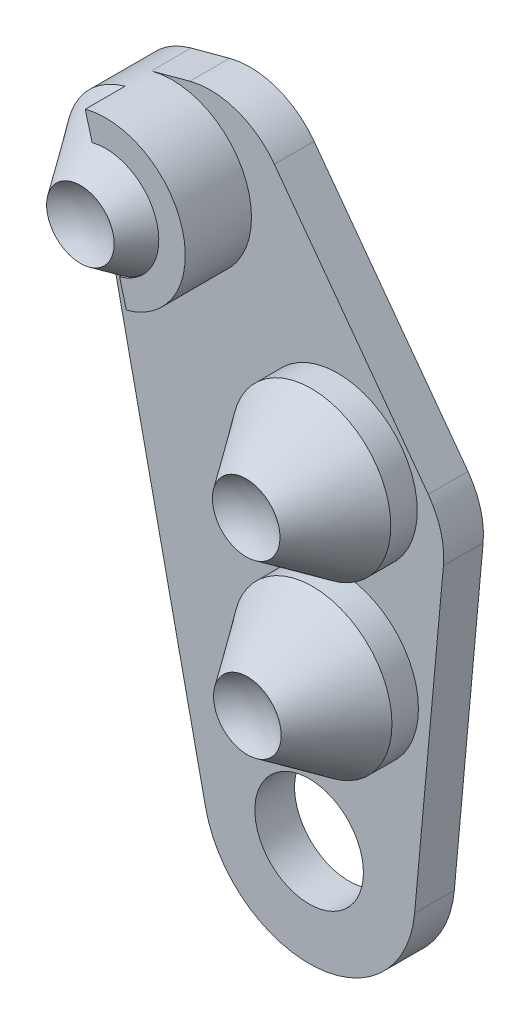
ISO-10303-21;
HEADER;
FILE_DESCRIPTION(('STEP AP214'),'2;1');
FILE_NAME('part.step','',(''),(''),'','','');
FILE_SCHEMA(('AUTOMOTIVE_DESIGN { 1 0 10303 214 1 1 1 1 }'));
ENDSEC;
DATA;
#1=APPLICATION_CONTEXT('core data for automotive mechanical design processes');
#2=APPLICATION_PROTOCOL_DEFINITION('international standard','automotive_design',2000,#1);
#3=PRODUCT_CONTEXT('',#1,'mechanical');
#4=PRODUCT('Part','Part','',(#3));
#5=PRODUCT_RELATED_PRODUCT_CATEGORY('part','',(#4));
#6=PRODUCT_DEFINITION_FORMATION('','',#4);
#7=PRODUCT_DEFINITION_CONTEXT('part definition',#1,'design');
#8=PRODUCT_DEFINITION('design','',#6,#7);
#9=PRODUCT_DEFINITION_SHAPE('','',#8);
#10=(LENGTH_UNIT() NAMED_UNIT(*) SI_UNIT(.MILLI.,.METRE.));
#11=(NAMED_UNIT(*) PLANE_ANGLE_UNIT() SI_UNIT($,.RADIAN.));
#12=(NAMED_UNIT(*) SI_UNIT($,.STERADIAN.) SOLID_ANGLE_UNIT());
#13=UNCERTAINTY_MEASURE_WITH_UNIT(LENGTH_MEASURE(1.E-05),#10,'distance_accuracy_value','');
#14=(GEOMETRIC_REPRESENTATION_CONTEXT(3) GLOBAL_UNCERTAINTY_ASSIGNED_CONTEXT((#13)) GLOBAL_UNIT_ASSIGNED_CONTEXT((#10,
#11,#12)) REPRESENTATION_CONTEXT('',''));
#15=CARTESIAN_POINT('',(0.,0.,0.));
#16=DIRECTION('',(0.,0.,1.));
#17=DIRECTION('',(1.,0.,0.));
#18=AXIS2_PLACEMENT_3D('',#15,#16,#17);
#19=CARTESIAN_POINT('',(-10.352761804101,38.6370330515627,10.));
#20=DIRECTION('',(0.,0.,-1.));
#21=DIRECTION('',(-1.,0.,0.));
#22=AXIS2_PLACEMENT_3D('',#19,#20,#21);
#23=CONICAL_SURFACE('',#22,2.49896230895139,0.610865238198022);
#24=CARTESIAN_POINT('',(-10.352761804101,38.6370330515627,9.92147057076465));
#25=DIRECTION('',(0.,0.,-1.));
#26=DIRECTION('',(-1.,0.,0.));
#27=AXIS2_PLACEMENT_3D('',#24,#25,#26);
#28=CIRCLE('',#27,2.55394920727329);
#29=CARTESIAN_POINT('',(-12.9067110113743,38.6370330515627,9.92147057076465));
#30=VERTEX_POINT('',#29);
#31=EDGE_CURVE('E275',#30,#30,#28,.F.);
#32=ORIENTED_EDGE('',*,*,#31,.F.);
#33=EDGE_LOOP('',(#32));
#34=FACE_BOUND('',#33,.T.);
#35=CARTESIAN_POINT('',(-10.352761804101,38.6370330515627,4.99999999999998));
#36=DIRECTION('',(0.,0.,1.));
#37=DIRECTION('',(1.,0.,0.));
#38=AXIS2_PLACEMENT_3D('',#35,#36,#37);
#39=CIRCLE('',#38,6.);
#40=CARTESIAN_POINT('',(-8.79984753348585,32.8414780938283,4.99999999999998));
#41=VERTEX_POINT('',#40);
#42=CARTESIAN_POINT('',(-11.9056760747161,44.4325880092971,4.99999999999998));
#43=VERTEX_POINT('',#42);
#44=EDGE_CURVE('E278',#41,#43,#39,.F.);
#45=ORIENTED_EDGE('',*,*,#44,.F.);
#46=DIRECTION('',(0.148452505549688,-0.554032293222328,-0.819152044288988));
#47=VECTOR('',#46,1.);
#48=CARTESIAN_POINT('',(-10.352761804101,38.6370330515627,13.5688880404525));
#49=LINE('',#48,#47);
#50=CARTESIAN_POINT('',(-9.3174856236909,34.7733297464064,7.85629601348416));
#51=VERTEX_POINT('',#50);
#52=EDGE_CURVE('E12',#41,#51,#49,.F.);
#53=ORIENTED_EDGE('',*,*,#52,.T.);
#54=CARTESIAN_POINT('',(-10.352761804101,38.6370330515627,7.85629601348416));
#55=DIRECTION('',(0.,0.,-1.));
#56=DIRECTION('',(-1.,0.,0.));
#57=AXIS2_PLACEMENT_3D('',#54,#55,#56);
#58=CIRCLE('',#57,4.00000000000001);
#59=CARTESIAN_POINT('',(-11.3880379845111,42.500736356719,7.85629601348415));
#60=VERTEX_POINT('',#59);
#61=EDGE_CURVE('E80',#60,#51,#58,.T.);
#62=ORIENTED_EDGE('',*,*,#61,.F.);
#63=DIRECTION('',(-0.148452505549687,0.554032293222328,-0.819152044288988));
#64=VECTOR('',#63,1.);
#65=CARTESIAN_POINT('',(-10.352761804101,38.6370330515627,13.5688880404525));
#66=LINE('',#65,#64);
#67=EDGE_CURVE('E90',#43,#60,#66,.F.);
#68=ORIENTED_EDGE('',*,*,#67,.F.);
#69=EDGE_LOOP('',(#45,#53,#62,#68));
#70=FACE_BOUND('',#69,.T.);
#71=ADVANCED_FACE('F72',(#34,#70),#23,.T.);
#72=CARTESIAN_POINT('',(0.,0.,3.));
#73=DIRECTION('',(0.,0.,-1.));
#74=DIRECTION('',(-1.,0.,0.));
#75=AXIS2_PLACEMENT_3D('',#72,#73,#74);
#76=CYLINDRICAL_SURFACE('',#75,8.);
#77=CARTESIAN_POINT('',(0.,0.,0.));
#78=DIRECTION('',(0.,0.,1.));
#79=DIRECTION('',(1.,0.,0.));
#80=AXIS2_PLACEMENT_3D('',#77,#78,#79);
#81=CIRCLE('',#80,8.);
#82=CARTESIAN_POINT('',(-7.82126892549614,-1.68159222020933,0.));
#83=VERTEX_POINT('',#82);
#84=CARTESIAN_POINT('',(7.96682404667648,-0.727814955395537,0.));
#85=VERTEX_POINT('',#84);
#86=EDGE_CURVE('E231',#83,#85,#81,.T.);
#87=ORIENTED_EDGE('',*,*,#86,.T.);
#88=DIRECTION('',(0.,0.,-1.));
#89=VECTOR('',#88,1.);
#90=CARTESIAN_POINT('',(7.96682404667648,-0.727814955395537,3.));
#91=LINE('',#90,#89);
#92=CARTESIAN_POINT('',(7.96682404667648,-0.727814955395537,3.));
#93=VERTEX_POINT('',#92);
#94=EDGE_CURVE('E247',#93,#85,#91,.T.);
#95=ORIENTED_EDGE('',*,*,#94,.F.);
#96=CARTESIAN_POINT('',(0.,0.,3.));
#97=DIRECTION('',(0.,0.,1.));
#98=DIRECTION('',(1.,0.,0.));
#99=AXIS2_PLACEMENT_3D('',#96,#97,#98);
#100=CIRCLE('',#99,8.);
#101=CARTESIAN_POINT('',(-7.82126892549614,-1.68159222020933,3.));
#102=VERTEX_POINT('',#101);
#103=EDGE_CURVE('E208',#102,#93,#100,.T.);
#104=ORIENTED_EDGE('',*,*,#103,.F.);
#105=DIRECTION('',(0.,0.,-1.));
#106=VECTOR('',#105,1.);
#107=CARTESIAN_POINT('',(-7.82126892549614,-1.68159222020933,3.));
#108=LINE('',#107,#106);
#109=EDGE_CURVE('E249',#102,#83,#108,.T.);
#110=ORIENTED_EDGE('',*,*,#109,.T.);
#111=EDGE_LOOP('',(#87,#95,#104,#110));
#112=FACE_BOUND('',#111,.T.);
#113=ADVANCED_FACE('F285',(#112),#76,.T.);
#114=CARTESIAN_POINT('',(7.96682404667648,-0.727814955395536,3.));
#115=DIRECTION('',(0.99585300583456,-0.090976869424442,0.));
#116=DIRECTION('',(0.090976869424442,0.99585300583456,0.));
#117=AXIS2_PLACEMENT_3D('',#114,#115,#116);
#118=PLANE('',#117);
#119=DIRECTION('',(-0.090976869424442,-0.99585300583456,0.));
#120=VECTOR('',#119,1.);
#121=CARTESIAN_POINT('',(7.96682404667648,-0.727814955395536,0.));
#122=LINE('',#121,#120);
#123=CARTESIAN_POINT('',(10.1426742990136,23.0895248557464,0.));
#124=VERTEX_POINT('',#123);
#125=EDGE_CURVE('E234',#124,#85,#122,.T.);
#126=ORIENTED_EDGE('',*,*,#125,.F.);
#127=DIRECTION('',(0.,0.,-1.));
#128=VECTOR('',#127,1.);
#129=CARTESIAN_POINT('',(10.1426742990136,23.0895248557464,3.));
#130=LINE('',#129,#128);
#131=CARTESIAN_POINT('',(10.1426742990136,23.0895248557464,3.));
#132=VERTEX_POINT('',#131);
#133=EDGE_CURVE('E245',#132,#124,#130,.T.);
#134=ORIENTED_EDGE('',*,*,#133,.F.);
#135=DIRECTION('',(-0.090976869424442,-0.99585300583456,0.));
#136=VECTOR('',#135,1.);
#137=CARTESIAN_POINT('',(7.96682404667648,-0.727814955395536,3.));
#138=LINE('',#137,#136);
#139=EDGE_CURVE('E211',#132,#93,#138,.T.);
#140=ORIENTED_EDGE('',*,*,#139,.T.);
#141=ORIENTED_EDGE('',*,*,#94,.T.);
#142=EDGE_LOOP('',(#126,#134,#140,#141));
#143=FACE_BOUND('',#142,.T.);
#144=ADVANCED_FACE('F287',(#143),#118,.T.);
#145=CARTESIAN_POINT('',(4.16755626400626,23.635386072293,3.));
#146=DIRECTION('',(0.,0.,-1.));
#147=DIRECTION('',(-1.,0.,0.));
#148=AXIS2_PLACEMENT_3D('',#145,#146,#147);
#149=CYLINDRICAL_SURFACE('',#148,6.);
#150=CARTESIAN_POINT('',(4.16755626400626,23.635386072293,0.));
#151=DIRECTION('',(0.,0.,1.));
#152=DIRECTION('',(1.,0.,0.));
#153=AXIS2_PLACEMENT_3D('',#150,#151,#152);
#154=CIRCLE('',#153,6.);
#155=CARTESIAN_POINT('',(8.99839288623359,27.1938994598394,0.));
#156=VERTEX_POINT('',#155);
#157=EDGE_CURVE('E237',#124,#156,#154,.T.);
#158=ORIENTED_EDGE('',*,*,#157,.T.);
#159=DIRECTION('',(0.,0.,-1.));
#160=VECTOR('',#159,1.);
#161=CARTESIAN_POINT('',(8.99839288623359,27.1938994598394,3.));
#162=LINE('',#161,#160);
#163=CARTESIAN_POINT('',(8.99839288623359,27.1938994598394,3.));
#164=VERTEX_POINT('',#163);
#165=EDGE_CURVE('E243',#164,#156,#162,.T.);
#166=ORIENTED_EDGE('',*,*,#165,.F.);
#167=CARTESIAN_POINT('',(4.16755626400626,23.635386072293,3.));
#168=DIRECTION('',(0.,0.,1.));
#169=DIRECTION('',(1.,0.,0.));
#170=AXIS2_PLACEMENT_3D('',#167,#168,#169);
#171=CIRCLE('',#170,6.);
#172=EDGE_CURVE('E214',#132,#164,#171,.T.);
#173=ORIENTED_EDGE('',*,*,#172,.F.);
#174=ORIENTED_EDGE('',*,*,#133,.T.);
#175=EDGE_LOOP('',(#158,#166,#173,#174));
#176=FACE_BOUND('',#175,.T.);
#177=ADVANCED_FACE('F299',(#176),#149,.T.);
#178=CARTESIAN_POINT('',(18.81874160834,13.8623491512695,3.));
#179=DIRECTION('',(0.80513943703789,0.593085564591071,0.));
#180=DIRECTION('',(-0.593085564591072,0.80513943703789,0.));
#181=AXIS2_PLACEMENT_3D('',#178,#179,#180);
#182=PLANE('',#181);
#183=DIRECTION('',(0.593085564591072,-0.80513943703789,0.));
#184=VECTOR('',#183,1.);
#185=CARTESIAN_POINT('',(18.81874160834,13.8623491512695,0.));
#186=LINE('',#185,#184);
#187=CARTESIAN_POINT('',(-2.62414770300646,42.9720035744167,0.));
#188=VERTEX_POINT('',#187);
#189=EDGE_CURVE('E202',#188,#156,#186,.T.);
#190=ORIENTED_EDGE('',*,*,#189,.F.);
#191=DIRECTION('',(0.,0.,-1.));
#192=VECTOR('',#191,1.);
#193=CARTESIAN_POINT('',(-2.62414770300646,42.9720035744167,3.));
#194=LINE('',#193,#192);
#195=CARTESIAN_POINT('',(-2.62414770300646,42.9720035744167,3.));
#196=VERTEX_POINT('',#195);
#197=EDGE_CURVE('E219',#196,#188,#194,.T.);
#198=ORIENTED_EDGE('',*,*,#197,.F.);
#199=DIRECTION('',(0.593085564591072,-0.80513943703789,0.));
#200=VECTOR('',#199,1.);
#201=CARTESIAN_POINT('',(18.81874160834,13.8623491512695,3.));
#202=LINE('',#201,#200);
#203=EDGE_CURVE('E216',#196,#164,#202,.T.);
#204=ORIENTED_EDGE('',*,*,#203,.T.);
#205=ORIENTED_EDGE('',*,*,#165,.T.);
#206=EDGE_LOOP('',(#190,#198,#204,#205));
#207=FACE_BOUND('',#206,.T.);
#208=ADVANCED_FACE('F305',(#207),#182,.T.);
#209=CARTESIAN_POINT('',(-7.45498432523379,39.4134901868702,3.));
#210=DIRECTION('',(0.,0.,-1.));
#211=DIRECTION('',(-1.,0.,0.));
#212=AXIS2_PLACEMENT_3D('',#209,#210,#211);
#213=CYLINDRICAL_SURFACE('',#212,6.);
#214=CARTESIAN_POINT('',(-7.45498432523379,39.4134901868702,0.));
#215=DIRECTION('',(0.,0.,1.));
#216=DIRECTION('',(1.,0.,0.));
#217=AXIS2_PLACEMENT_3D('',#214,#215,#216);
#218=CIRCLE('',#217,6.);
#219=CARTESIAN_POINT('',(-9.00789859584892,45.2090451446047,0.));
#220=VERTEX_POINT('',#219);
#221=EDGE_CURVE('E198',#188,#220,#218,.T.);
#222=ORIENTED_EDGE('',*,*,#221,.T.);
#223=DIRECTION('',(0.,0.,-1.));
#224=VECTOR('',#223,1.);
#225=CARTESIAN_POINT('',(-9.00789859584892,45.2090451446047,3.));
#226=LINE('',#225,#224);
#227=CARTESIAN_POINT('',(-9.00789859584892,45.2090451446047,3.));
#228=VERTEX_POINT('',#227);
#229=EDGE_CURVE('E255',#228,#220,#226,.T.);
#230=ORIENTED_EDGE('',*,*,#229,.F.);
#231=CARTESIAN_POINT('',(-7.45498432523379,39.4134901868702,3.));
#232=DIRECTION('',(0.,0.,1.));
#233=DIRECTION('',(1.,0.,0.));
#234=AXIS2_PLACEMENT_3D('',#231,#232,#233);
#235=CIRCLE('',#234,6.);
#236=EDGE_CURVE('E199',#196,#228,#235,.T.);
#237=ORIENTED_EDGE('',*,*,#236,.F.);
#238=ORIENTED_EDGE('',*,*,#197,.T.);
#239=EDGE_LOOP('',(#222,#230,#237,#238));
#240=FACE_BOUND('',#239,.T.);
#241=ADVANCED_FACE('F321',(#240),#213,.T.);
#242=CARTESIAN_POINT('',(-11.905676074716,44.4325880092971,3.));
#243=DIRECTION('',(-0.258819045102522,0.965925826289068,0.));
#244=DIRECTION('',(-0.965925826289068,-0.258819045102522,0.));
#245=AXIS2_PLACEMENT_3D('',#242,#243,#244);
#246=PLANE('',#245);
#247=DIRECTION('',(0.965925826289068,0.258819045102522,0.));
#248=VECTOR('',#247,1.);
#249=CARTESIAN_POINT('',(-11.905676074716,44.4325880092971,0.));
#250=LINE('',#249,#248);
#251=CARTESIAN_POINT('',(-11.9056760747161,44.4325880092971,0.));
#252=VERTEX_POINT('',#251);
#253=EDGE_CURVE('E222',#252,#220,#250,.T.);
#254=ORIENTED_EDGE('',*,*,#253,.F.);
#255=DIRECTION('',(0.,0.,-1.));
#256=VECTOR('',#255,1.);
#257=CARTESIAN_POINT('',(-11.9056760747161,44.4325880092971,3.));
#258=LINE('',#257,#256);
#259=CARTESIAN_POINT('',(-11.9056760747161,44.4325880092971,3.));
#260=VERTEX_POINT('',#259);
#261=EDGE_CURVE('E253',#260,#252,#258,.T.);
#262=ORIENTED_EDGE('',*,*,#261,.F.);
#263=DIRECTION('',(0.965925826289068,0.258819045102522,0.));
#264=VECTOR('',#263,1.);
#265=CARTESIAN_POINT('',(-11.905676074716,44.4325880092971,3.));
#266=LINE('',#265,#264);
#267=EDGE_CURVE('E201',#260,#228,#266,.T.);
#268=ORIENTED_EDGE('',*,*,#267,.T.);
#269=ORIENTED_EDGE('',*,*,#229,.T.);
#270=EDGE_LOOP('',(#254,#262,#268,#269));
#271=FACE_BOUND('',#270,.T.);
#272=ADVANCED_FACE('F317',(#271),#246,.T.);
#273=CARTESIAN_POINT('',(-10.352761804101,38.6370330515627,3.));
#274=DIRECTION('',(0.,0.,-1.));
#275=DIRECTION('',(-1.,0.,0.));
#276=AXIS2_PLACEMENT_3D('',#273,#274,#275);
#277=CYLINDRICAL_SURFACE('',#276,6.);
#278=DIRECTION('',(0.,0.,-1.));
#279=VECTOR('',#278,1.);
#280=CARTESIAN_POINT('',(-16.2187134982231,37.3758388864057,3.));
#281=LINE('',#280,#279);
#282=CARTESIAN_POINT('',(-16.2187134982231,37.3758388864057,3.));
#283=VERTEX_POINT('',#282);
#284=CARTESIAN_POINT('',(-16.2187134982231,37.3758388864057,0.));
#285=VERTEX_POINT('',#284);
#286=EDGE_CURVE('E251',#283,#285,#281,.T.);
#287=ORIENTED_EDGE('',*,*,#286,.F.);
#288=CARTESIAN_POINT('',(-10.352761804101,38.6370330515627,3.));
#289=DIRECTION('',(0.,0.,1.));
#290=DIRECTION('',(1.,0.,0.));
#291=AXIS2_PLACEMENT_3D('',#288,#289,#290);
#292=CIRCLE('',#291,6.);
#293=EDGE_CURVE('E257',#260,#283,#292,.F.);
#294=ORIENTED_EDGE('',*,*,#293,.F.);
#295=ORIENTED_EDGE('',*,*,#261,.T.);
#296=CARTESIAN_POINT('',(-10.352761804101,38.6370330515627,0.));
#297=DIRECTION('',(0.,0.,1.));
#298=DIRECTION('',(1.,0.,0.));
#299=AXIS2_PLACEMENT_3D('',#296,#297,#298);
#300=CIRCLE('',#299,6.);
#301=EDGE_CURVE('E225',#252,#285,#300,.T.);
#302=ORIENTED_EDGE('',*,*,#301,.T.);
#303=EDGE_LOOP('',(#287,#294,#295,#302));
#304=FACE_BOUND('',#303,.T.);
#305=DIRECTION('',(0.,0.,-1.));
#306=VECTOR('',#305,1.);
#307=CARTESIAN_POINT('',(-8.79984753348585,32.8414780938283,8.));
#308=LINE('',#307,#306);
#309=CARTESIAN_POINT('',(-8.79984753348585,32.8414780938283,8.));
#310=VERTEX_POINT('',#309);
#311=EDGE_CURVE('E167',#310,#41,#308,.T.);
#312=ORIENTED_EDGE('',*,*,#311,.T.);
#313=ORIENTED_EDGE('',*,*,#44,.T.);
#314=DIRECTION('',(0.,0.,-1.));
#315=VECTOR('',#314,1.);
#316=CARTESIAN_POINT('',(-11.9056760747161,44.4325880092971,8.));
#317=LINE('',#316,#315);
#318=CARTESIAN_POINT('',(-11.9056760747161,44.4325880092971,8.));
#319=VERTEX_POINT('',#318);
#320=EDGE_CURVE('E187',#319,#43,#317,.T.);
#321=ORIENTED_EDGE('',*,*,#320,.F.);
#322=CARTESIAN_POINT('',(-10.352761804101,38.6370330515627,8.));
#323=DIRECTION('',(0.,0.,1.));
#324=DIRECTION('',(1.,0.,0.));
#325=AXIS2_PLACEMENT_3D('',#322,#323,#324);
#326=CIRCLE('',#325,6.);
#327=EDGE_CURVE('E176',#319,#310,#326,.F.);
#328=ORIENTED_EDGE('',*,*,#327,.T.);
#329=EDGE_LOOP('',(#312,#313,#321,#328));
#330=FACE_BOUND('',#329,.T.);
#331=ADVANCED_FACE('F283',(#304,#330),#277,.T.);
#332=CARTESIAN_POINT('',(-7.82126892549614,-1.68159222020933,3.));
#333=DIRECTION('',(-0.977658615687017,-0.210199027526166,0.));
#334=DIRECTION('',(0.210199027526166,-0.977658615687017,0.));
#335=AXIS2_PLACEMENT_3D('',#332,#333,#334);
#336=PLANE('',#335);
#337=DIRECTION('',(-0.210199027526166,0.977658615687017,0.));
#338=VECTOR('',#337,1.);
#339=CARTESIAN_POINT('',(-7.82126892549614,-1.68159222020933,0.));
#340=LINE('',#339,#338);
#341=EDGE_CURVE('E228',#83,#285,#340,.T.);
#342=ORIENTED_EDGE('',*,*,#341,.F.);
#343=ORIENTED_EDGE('',*,*,#109,.F.);
#344=DIRECTION('',(-0.210199027526166,0.977658615687017,0.));
#345=VECTOR('',#344,1.);
#346=CARTESIAN_POINT('',(-7.82126892549614,-1.68159222020933,3.));
#347=LINE('',#346,#345);
#348=EDGE_CURVE('E205',#102,#283,#347,.T.);
#349=ORIENTED_EDGE('',*,*,#348,.T.);
#350=ORIENTED_EDGE('',*,*,#286,.T.);
#351=EDGE_LOOP('',(#342,#343,#349,#350));
#352=FACE_BOUND('',#351,.T.);
#353=ADVANCED_FACE('F311',(#352),#336,.T.);
#354=CARTESIAN_POINT('',(0.,0.,0.));
#355=DIRECTION('',(0.,0.,1.));
#356=DIRECTION('',(1.,0.,0.));
#357=AXIS2_PLACEMENT_3D('',#354,#355,#356);
#358=PLANE('',#357);
#359=ORIENTED_EDGE('',*,*,#341,.T.);
#360=ORIENTED_EDGE('',*,*,#301,.F.);
#361=ORIENTED_EDGE('',*,*,#253,.T.);
#362=ORIENTED_EDGE('',*,*,#221,.F.);
#363=ORIENTED_EDGE('',*,*,#189,.T.);
#364=ORIENTED_EDGE('',*,*,#157,.F.);
#365=ORIENTED_EDGE('',*,*,#125,.T.);
#366=ORIENTED_EDGE('',*,*,#86,.F.);
#367=EDGE_LOOP('',(#359,#360,#361,#362,#363,#364,#365,#366));
#368=FACE_BOUND('',#367,.T.);
#369=CARTESIAN_POINT('',(0.,0.,0.));
#370=DIRECTION('',(0.,0.,1.));
#371=DIRECTION('',(1.,0.,0.));
#372=AXIS2_PLACEMENT_3D('',#369,#370,#371);
#373=CIRCLE('',#372,4.1);
#374=CARTESIAN_POINT('',(4.1,0.,0.));
#375=VERTEX_POINT('',#374);
#376=EDGE_CURVE('E194',#375,#375,#373,.T.);
#377=ORIENTED_EDGE('',*,*,#376,.T.);
#378=EDGE_LOOP('',(#377));
#379=FACE_BOUND('',#378,.T.);
#380=ADVANCED_FACE('F314',(#368,#379),#358,.F.);
#381=CARTESIAN_POINT('',(0.,0.,3.));
#382=DIRECTION('',(0.,0.,1.));
#383=DIRECTION('',(1.,0.,0.));
#384=AXIS2_PLACEMENT_3D('',#381,#382,#383);
#385=PLANE('',#384);
#386=CARTESIAN_POINT('',(2.25742630967006,12.8025007891587,3.));
#387=DIRECTION('',(0.,0.,1.));
#388=DIRECTION('',(1.,0.,0.));
#389=AXIS2_PLACEMENT_3D('',#386,#387,#388);
#390=CIRCLE('',#389,6.);
#391=CARTESIAN_POINT('',(8.25742630967006,12.8025007891587,3.));
#392=VERTEX_POINT('',#391);
#393=EDGE_CURVE('E166',#392,#392,#390,.F.);
#394=ORIENTED_EDGE('',*,*,#393,.T.);
#395=EDGE_LOOP('',(#394));
#396=FACE_BOUND('',#395,.T.);
#397=CARTESIAN_POINT('',(2.16755626400626,25.7016833681105,3.));
#398=DIRECTION('',(0.,0.,1.));
#399=DIRECTION('',(1.,0.,0.));
#400=AXIS2_PLACEMENT_3D('',#397,#398,#399);
#401=CIRCLE('',#400,6.);
#402=CARTESIAN_POINT('',(8.16755626400626,25.7016833681105,3.));
#403=VERTEX_POINT('',#402);
#404=EDGE_CURVE('E195',#403,#403,#401,.F.);
#405=ORIENTED_EDGE('',*,*,#404,.T.);
#406=EDGE_LOOP('',(#405));
#407=FACE_BOUND('',#406,.T.);
#408=CARTESIAN_POINT('',(0.,0.,3.));
#409=DIRECTION('',(0.,0.,1.));
#410=DIRECTION('',(1.,0.,0.));
#411=AXIS2_PLACEMENT_3D('',#408,#409,#410);
#412=CIRCLE('',#411,4.1);
#413=CARTESIAN_POINT('',(4.1,0.,3.));
#414=VERTEX_POINT('',#413);
#415=EDGE_CURVE('E191',#414,#414,#412,.T.);
#416=ORIENTED_EDGE('',*,*,#415,.F.);
#417=EDGE_LOOP('',(#416));
#418=FACE_BOUND('',#417,.T.);
#419=ORIENTED_EDGE('',*,*,#267,.F.);
#420=ORIENTED_EDGE('',*,*,#293,.T.);
#421=ORIENTED_EDGE('',*,*,#348,.F.);
#422=ORIENTED_EDGE('',*,*,#103,.T.);
#423=ORIENTED_EDGE('',*,*,#139,.F.);
#424=ORIENTED_EDGE('',*,*,#172,.T.);
#425=ORIENTED_EDGE('',*,*,#203,.F.);
#426=ORIENTED_EDGE('',*,*,#236,.T.);
#427=EDGE_LOOP('',(#419,#420,#421,#422,#423,#424,#425,#426));
#428=FACE_BOUND('',#427,.T.);
#429=ADVANCED_FACE('F296',(#396,#407,#418,#428),#385,.T.);
#430=CARTESIAN_POINT('',(0.,0.,-47.));
#431=DIRECTION('',(0.,0.,1.));
#432=DIRECTION('',(1.,0.,0.));
#433=AXIS2_PLACEMENT_3D('',#430,#431,#432);
#434=CYLINDRICAL_SURFACE('',#433,4.1);
#435=ORIENTED_EDGE('',*,*,#415,.T.);
#436=EDGE_LOOP('',(#435));
#437=FACE_BOUND('',#436,.T.);
#438=ORIENTED_EDGE('',*,*,#376,.F.);
#439=EDGE_LOOP('',(#438));
#440=FACE_BOUND('',#439,.T.);
#441=ADVANCED_FACE('F295',(#437,#440),#434,.F.);
#442=CARTESIAN_POINT('',(2.16755626400626,25.7016833681105,10.));
#443=DIRECTION('',(0.,0.,-1.));
#444=DIRECTION('',(-1.,0.,0.));
#445=AXIS2_PLACEMENT_3D('',#442,#443,#444);
#446=CYLINDRICAL_SURFACE('',#445,6.);
#447=CARTESIAN_POINT('',(2.16755626400626,25.7016833681105,4.99999999999998));
#448=DIRECTION('',(0.,0.,1.));
#449=DIRECTION('',(1.,0.,0.));
#450=AXIS2_PLACEMENT_3D('',#447,#448,#449);
#451=CIRCLE('',#450,6.);
#452=CARTESIAN_POINT('',(8.16755626400626,25.7016833681105,4.99999999999998));
#453=VERTEX_POINT('',#452);
#454=EDGE_CURVE('E272',#453,#453,#451,.F.);
#455=ORIENTED_EDGE('',*,*,#454,.T.);
#456=EDGE_LOOP('',(#455));
#457=FACE_BOUND('',#456,.T.);
#458=ORIENTED_EDGE('',*,*,#404,.F.);
#459=EDGE_LOOP('',(#458));
#460=FACE_BOUND('',#459,.T.);
#461=ADVANCED_FACE('F362',(#457,#460),#446,.T.);
#462=CARTESIAN_POINT('',(2.25742630967006,12.8025007891587,10.));
#463=DIRECTION('',(0.,0.,-1.));
#464=DIRECTION('',(-1.,0.,0.));
#465=AXIS2_PLACEMENT_3D('',#462,#463,#464);
#466=CYLINDRICAL_SURFACE('',#465,6.);
#467=CARTESIAN_POINT('',(2.25742630967006,12.8025007891587,4.99999999999998));
#468=DIRECTION('',(0.,0.,1.));
#469=DIRECTION('',(1.,0.,0.));
#470=AXIS2_PLACEMENT_3D('',#467,#468,#469);
#471=CIRCLE('',#470,6.);
#472=CARTESIAN_POINT('',(8.25742630967006,12.8025007891587,4.99999999999998));
#473=VERTEX_POINT('',#472);
#474=EDGE_CURVE('E266',#473,#473,#471,.F.);
#475=ORIENTED_EDGE('',*,*,#474,.T.);
#476=EDGE_LOOP('',(#475));
#477=FACE_BOUND('',#476,.T.);
#478=ORIENTED_EDGE('',*,*,#393,.F.);
#479=EDGE_LOOP('',(#478));
#480=FACE_BOUND('',#479,.T.);
#481=ADVANCED_FACE('F356',(#477,#480),#466,.T.);
#482=CARTESIAN_POINT('',(-10.352761804101,38.6370330515627,13.));
#483=DIRECTION('',(0.,1.,0.));
#484=DIRECTION('',(0.,0.,-1.));
#485=AXIS2_PLACEMENT_3D('',#482,#483,#484);
#486=SPHERICAL_SURFACE('',#485,4.);
#487=CARTESIAN_POINT('',(-10.352761804101,38.6370330515627,13.));
#488=DIRECTION('',(0.,0.,-1.));
#489=DIRECTION('',(-1.,0.,0.));
#490=AXIS2_PLACEMENT_3D('',#487,#488,#489);
#491=SPHERICAL_SURFACE('',#490,4.);
#492=ORIENTED_EDGE('',*,*,#31,.T.);
#493=EDGE_LOOP('',(#492));
#494=FACE_BOUND('',#493,.T.);
#495=ADVANCED_FACE('F348',(#494),#491,.F.);
#496=CARTESIAN_POINT('',(2.16755626400626,25.7016833681105,13.));
#497=DIRECTION('',(0.,1.,0.));
#498=DIRECTION('',(0.,0.,-1.));
#499=AXIS2_PLACEMENT_3D('',#496,#497,#498);
#500=SPHERICAL_SURFACE('',#499,4.);
#501=CARTESIAN_POINT('',(2.16755626400626,25.7016833681105,13.));
#502=DIRECTION('',(0.,0.,-1.));
#503=DIRECTION('',(-1.,0.,0.));
#504=AXIS2_PLACEMENT_3D('',#501,#502,#503);
#505=SPHERICAL_SURFACE('',#504,4.);
#506=CARTESIAN_POINT('',(2.16755626400626,25.7016833681105,9.92147057076465));
#507=DIRECTION('',(0.,0.,-1.));
#508=DIRECTION('',(-1.,0.,0.));
#509=AXIS2_PLACEMENT_3D('',#506,#507,#508);
#510=CIRCLE('',#509,2.55394920727329);
#511=CARTESIAN_POINT('',(-0.386392943267035,25.7016833681105,9.92147057076465));
#512=VERTEX_POINT('',#511);
#513=EDGE_CURVE('E269',#512,#512,#510,.F.);
#514=ORIENTED_EDGE('',*,*,#513,.T.);
#515=EDGE_LOOP('',(#514));
#516=FACE_BOUND('',#515,.T.);
#517=ADVANCED_FACE('F346',(#516),#505,.F.);
#518=CARTESIAN_POINT('',(2.25742630967006,12.8025007891587,13.));
#519=DIRECTION('',(0.,1.,0.));
#520=DIRECTION('',(0.,0.,-1.));
#521=AXIS2_PLACEMENT_3D('',#518,#519,#520);
#522=SPHERICAL_SURFACE('',#521,4.);
#523=CARTESIAN_POINT('',(2.25742630967006,12.8025007891587,13.));
#524=DIRECTION('',(0.,0.,-1.));
#525=DIRECTION('',(-1.,0.,0.));
#526=AXIS2_PLACEMENT_3D('',#523,#524,#525);
#527=SPHERICAL_SURFACE('',#526,4.);
#528=CARTESIAN_POINT('',(2.25742630967006,12.8025007891587,9.92147057076465));
#529=DIRECTION('',(0.,0.,-1.));
#530=DIRECTION('',(-1.,0.,0.));
#531=AXIS2_PLACEMENT_3D('',#528,#529,#530);
#532=CIRCLE('',#531,2.55394920727329);
#533=CARTESIAN_POINT('',(-0.296522897603232,12.8025007891587,9.92147057076465));
#534=VERTEX_POINT('',#533);
#535=EDGE_CURVE('E259',#534,#534,#532,.F.);
#536=ORIENTED_EDGE('',*,*,#535,.T.);
#537=EDGE_LOOP('',(#536));
#538=FACE_BOUND('',#537,.T.);
#539=ADVANCED_FACE('F333',(#538),#527,.F.);
#540=CARTESIAN_POINT('',(2.25742630967006,12.8025007891587,10.));
#541=DIRECTION('',(0.,0.,-1.));
#542=DIRECTION('',(-1.,0.,0.));
#543=AXIS2_PLACEMENT_3D('',#540,#541,#542);
#544=CONICAL_SURFACE('',#543,2.49896230895139,0.610865238198022);
#545=ORIENTED_EDGE('',*,*,#474,.F.);
#546=EDGE_LOOP('',(#545));
#547=FACE_BOUND('',#546,.T.);
#548=ORIENTED_EDGE('',*,*,#535,.F.);
#549=EDGE_LOOP('',(#548));
#550=FACE_BOUND('',#549,.T.);
#551=ADVANCED_FACE('F327',(#547,#550),#544,.T.);
#552=CARTESIAN_POINT('',(2.16755626400626,25.7016833681105,10.));
#553=DIRECTION('',(0.,0.,-1.));
#554=DIRECTION('',(-1.,0.,0.));
#555=AXIS2_PLACEMENT_3D('',#552,#553,#554);
#556=CONICAL_SURFACE('',#555,2.49896230895139,0.610865238198022);
#557=ORIENTED_EDGE('',*,*,#454,.F.);
#558=EDGE_LOOP('',(#557));
#559=FACE_BOUND('',#558,.T.);
#560=ORIENTED_EDGE('',*,*,#513,.F.);
#561=EDGE_LOOP('',(#560));
#562=FACE_BOUND('',#561,.T.);
#563=ADVANCED_FACE('F332',(#559,#562),#556,.T.);
#564=CARTESIAN_POINT('',(-10.352761804101,38.6370330515627,8.));
#565=DIRECTION('',(0.,0.,-1.));
#566=DIRECTION('',(-1.,0.,0.));
#567=AXIS2_PLACEMENT_3D('',#564,#565,#566);
#568=CYLINDRICAL_SURFACE('',#567,4.00000000000001);
#569=DIRECTION('',(0.,0.,-1.));
#570=VECTOR('',#569,1.);
#571=CARTESIAN_POINT('',(-11.3880379845111,42.500736356719,8.));
#572=LINE('',#571,#570);
#573=CARTESIAN_POINT('',(-11.3880379845111,42.500736356719,8.));
#574=VERTEX_POINT('',#573);
#575=EDGE_CURVE('E185',#574,#60,#572,.T.);
#576=ORIENTED_EDGE('',*,*,#575,.T.);
#577=ORIENTED_EDGE('',*,*,#61,.T.);
#578=DIRECTION('',(0.,0.,-1.));
#579=VECTOR('',#578,1.);
#580=CARTESIAN_POINT('',(-9.31748562369089,34.7733297464064,8.));
#581=LINE('',#580,#579);
#582=CARTESIAN_POINT('',(-9.31748562369089,34.7733297464064,8.));
#583=VERTEX_POINT('',#582);
#584=EDGE_CURVE('E158',#583,#51,#581,.T.);
#585=ORIENTED_EDGE('',*,*,#584,.F.);
#586=CARTESIAN_POINT('',(-10.352761804101,38.6370330515627,8.));
#587=DIRECTION('',(0.,0.,1.));
#588=DIRECTION('',(1.,0.,0.));
#589=AXIS2_PLACEMENT_3D('',#586,#587,#588);
#590=CIRCLE('',#589,4.00000000000001);
#591=EDGE_CURVE('E163',#583,#574,#590,.T.);
#592=ORIENTED_EDGE('',*,*,#591,.T.);
#593=EDGE_LOOP('',(#576,#577,#585,#592));
#594=FACE_BOUND('',#593,.T.);
#595=ADVANCED_FACE('F161',(#594),#568,.F.);
#596=CARTESIAN_POINT('',(0.,0.,8.));
#597=DIRECTION('',(0.965925826289067,0.258819045102525,0.));
#598=DIRECTION('',(-0.258819045102525,0.965925826289067,0.));
#599=AXIS2_PLACEMENT_3D('',#596,#597,#598);
#600=PLANE('',#599);
#601=ORIENTED_EDGE('',*,*,#52,.F.);
#602=ORIENTED_EDGE('',*,*,#311,.F.);
#603=DIRECTION('',(0.258819045102525,-0.965925826289067,0.));
#604=VECTOR('',#603,1.);
#605=CARTESIAN_POINT('',(0.,0.,8.));
#606=LINE('',#605,#604);
#607=EDGE_CURVE('E170',#583,#310,#606,.T.);
#608=ORIENTED_EDGE('',*,*,#607,.F.);
#609=ORIENTED_EDGE('',*,*,#584,.T.);
#610=EDGE_LOOP('',(#601,#602,#608,#609));
#611=FACE_BOUND('',#610,.T.);
#612=ADVANCED_FACE('F171',(#611),#600,.F.);
#613=CARTESIAN_POINT('',(0.,0.,8.));
#614=DIRECTION('',(-0.965925826289068,-0.258819045102523,0.));
#615=DIRECTION('',(0.258819045102523,-0.965925826289068,0.));
#616=AXIS2_PLACEMENT_3D('',#613,#614,#615);
#617=PLANE('',#616);
#618=ORIENTED_EDGE('',*,*,#320,.T.);
#619=ORIENTED_EDGE('',*,*,#67,.T.);
#620=ORIENTED_EDGE('',*,*,#575,.F.);
#621=DIRECTION('',(-0.258819045102523,0.965925826289068,0.));
#622=VECTOR('',#621,1.);
#623=CARTESIAN_POINT('',(0.,0.,8.));
#624=LINE('',#623,#622);
#625=EDGE_CURVE('E180',#574,#319,#624,.T.);
#626=ORIENTED_EDGE('',*,*,#625,.T.);
#627=EDGE_LOOP('',(#618,#619,#620,#626));
#628=FACE_BOUND('',#627,.T.);
#629=ADVANCED_FACE('F281',(#628),#617,.T.);
#630=CARTESIAN_POINT('',(0.,0.,8.));
#631=DIRECTION('',(0.,0.,1.));
#632=DIRECTION('',(1.,0.,0.));
#633=AXIS2_PLACEMENT_3D('',#630,#631,#632);
#634=PLANE('',#633);
#635=ORIENTED_EDGE('',*,*,#591,.F.);
#636=ORIENTED_EDGE('',*,*,#607,.T.);
#637=ORIENTED_EDGE('',*,*,#327,.F.);
#638=ORIENTED_EDGE('',*,*,#625,.F.);
#639=EDGE_LOOP('',(#635,#636,#637,#638));
#640=FACE_BOUND('',#639,.T.);
#641=ADVANCED_FACE('F178',(#640),#634,.T.);
#642=CLOSED_SHELL('',(#71,#113,#144,#177,#208,#241,#272,#331,#353,#380,#429,#441,#461,#481,#495,
#517,#539,#551,#563,#595,#612,#629,#641));
#643=MANIFOLD_SOLID_BREP('B2',#642);
#644=ADVANCED_BREP_SHAPE_REPRESENTATION('',(#18,#643),#14);
#645=SHAPE_DEFINITION_REPRESENTATION(#9,#644);
ENDSEC;
END-ISO-10303-21;
